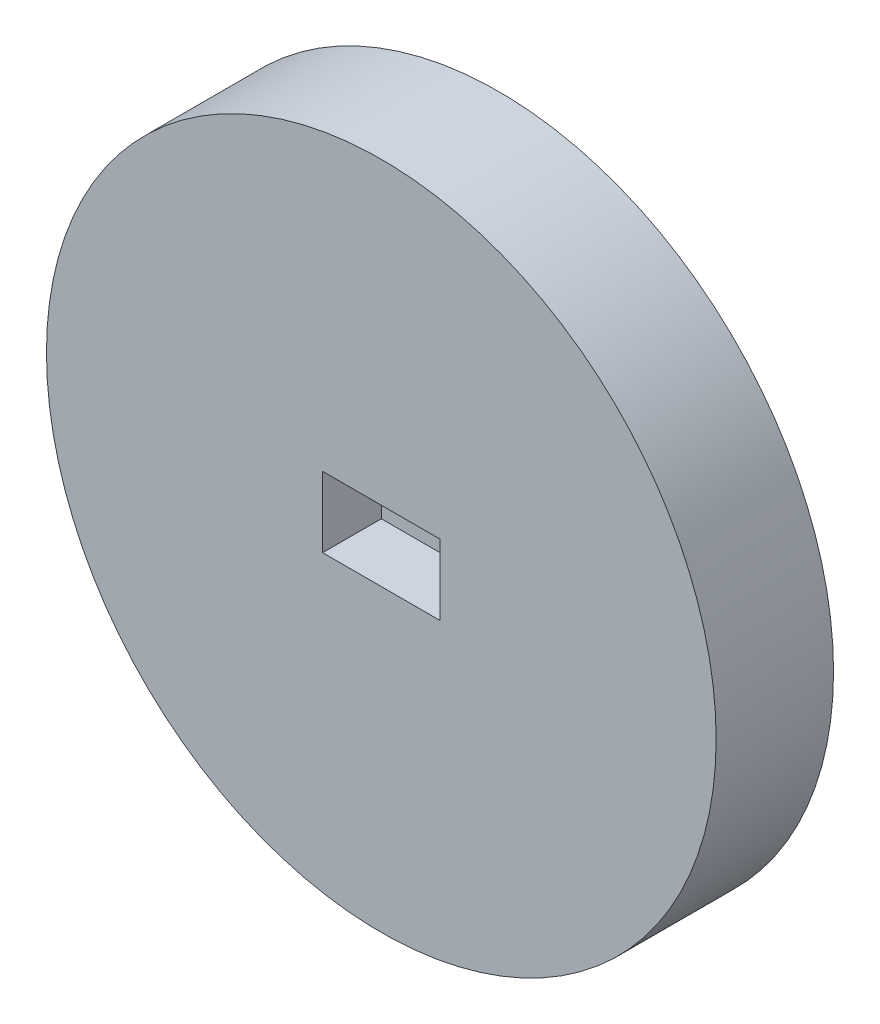
ISO-10303-21;
HEADER;
FILE_DESCRIPTION(('STEP AP214'),'2;1');
FILE_NAME('part.step','',(''),(''),'','','');
FILE_SCHEMA(('AUTOMOTIVE_DESIGN { 1 0 10303 214 1 1 1 1 }'));
ENDSEC;
DATA;
#1=APPLICATION_CONTEXT('core data for automotive mechanical design processes');
#2=APPLICATION_PROTOCOL_DEFINITION('international standard','automotive_design',2000,#1);
#3=PRODUCT_CONTEXT('',#1,'mechanical');
#4=PRODUCT('Part','Part','',(#3));
#5=PRODUCT_RELATED_PRODUCT_CATEGORY('part','',(#4));
#6=PRODUCT_DEFINITION_FORMATION('','',#4);
#7=PRODUCT_DEFINITION_CONTEXT('part definition',#1,'design');
#8=PRODUCT_DEFINITION('design','',#6,#7);
#9=PRODUCT_DEFINITION_SHAPE('','',#8);
#10=(LENGTH_UNIT() NAMED_UNIT(*) SI_UNIT(.MILLI.,.METRE.));
#11=(NAMED_UNIT(*) PLANE_ANGLE_UNIT() SI_UNIT($,.RADIAN.));
#12=(NAMED_UNIT(*) SI_UNIT($,.STERADIAN.) SOLID_ANGLE_UNIT());
#13=UNCERTAINTY_MEASURE_WITH_UNIT(LENGTH_MEASURE(1.E-05),#10,'distance_accuracy_value','');
#14=(GEOMETRIC_REPRESENTATION_CONTEXT(3) GLOBAL_UNCERTAINTY_ASSIGNED_CONTEXT((#13)) GLOBAL_UNIT_ASSIGNED_CONTEXT((#10,
#11,#12)) REPRESENTATION_CONTEXT('',''));
#15=CARTESIAN_POINT('',(0.,0.,0.));
#16=DIRECTION('',(0.,0.,1.));
#17=DIRECTION('',(1.,0.,0.));
#18=AXIS2_PLACEMENT_3D('',#15,#16,#17);
#19=CARTESIAN_POINT('',(0.,0.,5.));
#20=DIRECTION('',(0.,0.,-1.));
#21=DIRECTION('',(-1.,0.,0.));
#22=AXIS2_PLACEMENT_3D('',#19,#20,#21);
#23=CYLINDRICAL_SURFACE('',#22,28.5252343689779);
#24=CARTESIAN_POINT('',(0.,0.,5.));
#25=DIRECTION('',(0.,0.,1.));
#26=DIRECTION('',(1.,0.,0.));
#27=AXIS2_PLACEMENT_3D('',#24,#25,#26);
#28=CIRCLE('',#27,28.5252343689779);
#29=CARTESIAN_POINT('',(28.5252343689779,0.,5.));
#30=VERTEX_POINT('',#29);
#31=EDGE_CURVE('E116',#30,#30,#28,.T.);
#32=ORIENTED_EDGE('',*,*,#31,.F.);
#33=EDGE_LOOP('',(#32));
#34=FACE_BOUND('',#33,.T.);
#35=CARTESIAN_POINT('',(0.,0.,-5.));
#36=DIRECTION('',(0.,0.,1.));
#37=DIRECTION('',(1.,0.,0.));
#38=AXIS2_PLACEMENT_3D('',#35,#36,#37);
#39=CIRCLE('',#38,28.5252343689779);
#40=CARTESIAN_POINT('',(28.5252343689779,0.,-5.));
#41=VERTEX_POINT('',#40);
#42=EDGE_CURVE('E110',#41,#41,#39,.T.);
#43=ORIENTED_EDGE('',*,*,#42,.T.);
#44=EDGE_LOOP('',(#43));
#45=FACE_BOUND('',#44,.T.);
#46=ADVANCED_FACE('F39',(#34,#45),#23,.T.);
#47=CARTESIAN_POINT('',(0.,0.,5.));
#48=DIRECTION('',(0.,0.,1.));
#49=DIRECTION('',(1.,0.,0.));
#50=AXIS2_PLACEMENT_3D('',#47,#48,#49);
#51=PLANE('',#50);
#52=DIRECTION('',(0.,1.,0.));
#53=VECTOR('',#52,1.);
#54=CARTESIAN_POINT('',(5.,0.,5.));
#55=LINE('',#54,#53);
#56=CARTESIAN_POINT('',(5.,-3.,5.));
#57=VERTEX_POINT('',#56);
#58=CARTESIAN_POINT('',(5.,3.,5.));
#59=VERTEX_POINT('',#58);
#60=EDGE_CURVE('E11',#57,#59,#55,.T.);
#61=ORIENTED_EDGE('',*,*,#60,.F.);
#62=DIRECTION('',(1.,0.,0.));
#63=VECTOR('',#62,1.);
#64=CARTESIAN_POINT('',(0.,-3.,5.));
#65=LINE('',#64,#63);
#66=CARTESIAN_POINT('',(-5.,-3.,5.));
#67=VERTEX_POINT('',#66);
#68=EDGE_CURVE('E47',#67,#57,#65,.T.);
#69=ORIENTED_EDGE('',*,*,#68,.F.);
#70=DIRECTION('',(0.,-1.,0.));
#71=VECTOR('',#70,1.);
#72=CARTESIAN_POINT('',(-5.,0.,5.));
#73=LINE('',#72,#71);
#74=CARTESIAN_POINT('',(-5.,3.,5.));
#75=VERTEX_POINT('',#74);
#76=EDGE_CURVE('E126',#75,#67,#73,.T.);
#77=ORIENTED_EDGE('',*,*,#76,.F.);
#78=DIRECTION('',(-1.,0.,0.));
#79=VECTOR('',#78,1.);
#80=CARTESIAN_POINT('',(0.,3.,5.));
#81=LINE('',#80,#79);
#82=EDGE_CURVE('E120',#59,#75,#81,.T.);
#83=ORIENTED_EDGE('',*,*,#82,.F.);
#84=EDGE_LOOP('',(#61,#69,#77,#83));
#85=FACE_BOUND('',#84,.T.);
#86=ORIENTED_EDGE('',*,*,#31,.T.);
#87=EDGE_LOOP('',(#86));
#88=FACE_BOUND('',#87,.T.);
#89=ADVANCED_FACE('F134',(#85,#88),#51,.T.);
#90=CARTESIAN_POINT('',(0.,0.,-5.));
#91=DIRECTION('',(0.,0.,1.));
#92=DIRECTION('',(1.,0.,0.));
#93=AXIS2_PLACEMENT_3D('',#90,#91,#92);
#94=PLANE('',#93);
#95=ORIENTED_EDGE('',*,*,#42,.F.);
#96=EDGE_LOOP('',(#95));
#97=FACE_BOUND('',#96,.T.);
#98=ADVANCED_FACE('F137',(#97),#94,.F.);
#99=CARTESIAN_POINT('',(5.,3.,0.));
#100=DIRECTION('',(1.,0.,0.));
#101=DIRECTION('',(0.,0.,-1.));
#102=AXIS2_PLACEMENT_3D('',#99,#100,#101);
#103=PLANE('',#102);
#104=ORIENTED_EDGE('',*,*,#60,.T.);
#105=DIRECTION('',(0.,0.,1.));
#106=VECTOR('',#105,1.);
#107=CARTESIAN_POINT('',(5.,3.,0.));
#108=LINE('',#107,#106);
#109=CARTESIAN_POINT('',(5.,3.,0.));
#110=VERTEX_POINT('',#109);
#111=EDGE_CURVE('E54',#110,#59,#108,.T.);
#112=ORIENTED_EDGE('',*,*,#111,.F.);
#113=DIRECTION('',(0.,1.,0.));
#114=VECTOR('',#113,1.);
#115=CARTESIAN_POINT('',(5.,3.,0.));
#116=LINE('',#115,#114);
#117=CARTESIAN_POINT('',(5.,-3.,0.));
#118=VERTEX_POINT('',#117);
#119=EDGE_CURVE('E80',#118,#110,#116,.T.);
#120=ORIENTED_EDGE('',*,*,#119,.F.);
#121=DIRECTION('',(0.,0.,1.));
#122=VECTOR('',#121,1.);
#123=CARTESIAN_POINT('',(5.,-3.,0.));
#124=LINE('',#123,#122);
#125=EDGE_CURVE('E107',#118,#57,#124,.T.);
#126=ORIENTED_EDGE('',*,*,#125,.T.);
#127=EDGE_LOOP('',(#104,#112,#120,#126));
#128=FACE_BOUND('',#127,.T.);
#129=ADVANCED_FACE('F78',(#128),#103,.F.);
#130=CARTESIAN_POINT('',(-5.,-3.,0.));
#131=DIRECTION('',(0.,-1.,0.));
#132=DIRECTION('',(0.,0.,-1.));
#133=AXIS2_PLACEMENT_3D('',#130,#131,#132);
#134=PLANE('',#133);
#135=ORIENTED_EDGE('',*,*,#68,.T.);
#136=ORIENTED_EDGE('',*,*,#125,.F.);
#137=DIRECTION('',(1.,0.,0.));
#138=VECTOR('',#137,1.);
#139=CARTESIAN_POINT('',(-5.,-3.,0.));
#140=LINE('',#139,#138);
#141=CARTESIAN_POINT('',(-5.,-3.,0.));
#142=VERTEX_POINT('',#141);
#143=EDGE_CURVE('E86',#142,#118,#140,.T.);
#144=ORIENTED_EDGE('',*,*,#143,.F.);
#145=DIRECTION('',(0.,0.,1.));
#146=VECTOR('',#145,1.);
#147=CARTESIAN_POINT('',(-5.,-3.,0.));
#148=LINE('',#147,#146);
#149=EDGE_CURVE('E111',#142,#67,#148,.T.);
#150=ORIENTED_EDGE('',*,*,#149,.T.);
#151=EDGE_LOOP('',(#135,#136,#144,#150));
#152=FACE_BOUND('',#151,.T.);
#153=ADVANCED_FACE('F133',(#152),#134,.F.);
#154=CARTESIAN_POINT('',(-5.,3.,0.));
#155=DIRECTION('',(-1.,0.,0.));
#156=DIRECTION('',(0.,0.,1.));
#157=AXIS2_PLACEMENT_3D('',#154,#155,#156);
#158=PLANE('',#157);
#159=ORIENTED_EDGE('',*,*,#76,.T.);
#160=ORIENTED_EDGE('',*,*,#149,.F.);
#161=DIRECTION('',(0.,-1.,0.));
#162=VECTOR('',#161,1.);
#163=CARTESIAN_POINT('',(-5.,3.,0.));
#164=LINE('',#163,#162);
#165=CARTESIAN_POINT('',(-5.,3.,0.));
#166=VERTEX_POINT('',#165);
#167=EDGE_CURVE('E96',#166,#142,#164,.T.);
#168=ORIENTED_EDGE('',*,*,#167,.F.);
#169=DIRECTION('',(0.,0.,1.));
#170=VECTOR('',#169,1.);
#171=CARTESIAN_POINT('',(-5.,3.,0.));
#172=LINE('',#171,#170);
#173=EDGE_CURVE('E85',#166,#75,#172,.T.);
#174=ORIENTED_EDGE('',*,*,#173,.T.);
#175=EDGE_LOOP('',(#159,#160,#168,#174));
#176=FACE_BOUND('',#175,.T.);
#177=ADVANCED_FACE('F131',(#176),#158,.F.);
#178=CARTESIAN_POINT('',(-5.,3.,0.));
#179=DIRECTION('',(0.,1.,0.));
#180=DIRECTION('',(0.,0.,1.));
#181=AXIS2_PLACEMENT_3D('',#178,#179,#180);
#182=PLANE('',#181);
#183=ORIENTED_EDGE('',*,*,#82,.T.);
#184=ORIENTED_EDGE('',*,*,#173,.F.);
#185=DIRECTION('',(-1.,0.,0.));
#186=VECTOR('',#185,1.);
#187=CARTESIAN_POINT('',(-5.,3.,0.));
#188=LINE('',#187,#186);
#189=EDGE_CURVE('E89',#110,#166,#188,.T.);
#190=ORIENTED_EDGE('',*,*,#189,.F.);
#191=ORIENTED_EDGE('',*,*,#111,.T.);
#192=EDGE_LOOP('',(#183,#184,#190,#191));
#193=FACE_BOUND('',#192,.T.);
#194=ADVANCED_FACE('F90',(#193),#182,.F.);
#195=CARTESIAN_POINT('',(0.,0.,0.));
#196=DIRECTION('',(0.,0.,1.));
#197=DIRECTION('',(1.,0.,0.));
#198=AXIS2_PLACEMENT_3D('',#195,#196,#197);
#199=PLANE('',#198);
#200=ORIENTED_EDGE('',*,*,#119,.T.);
#201=ORIENTED_EDGE('',*,*,#189,.T.);
#202=ORIENTED_EDGE('',*,*,#167,.T.);
#203=ORIENTED_EDGE('',*,*,#143,.T.);
#204=EDGE_LOOP('',(#200,#201,#202,#203));
#205=FACE_BOUND('',#204,.T.);
#206=ADVANCED_FACE('F98',(#205),#199,.T.);
#207=CLOSED_SHELL('',(#46,#89,#98,#129,#153,#177,#194,#206));
#208=MANIFOLD_SOLID_BREP('B2',#207);
#209=ADVANCED_BREP_SHAPE_REPRESENTATION('',(#18,#208),#14);
#210=SHAPE_DEFINITION_REPRESENTATION(#9,#209);
ENDSEC;
END-ISO-10303-21;
